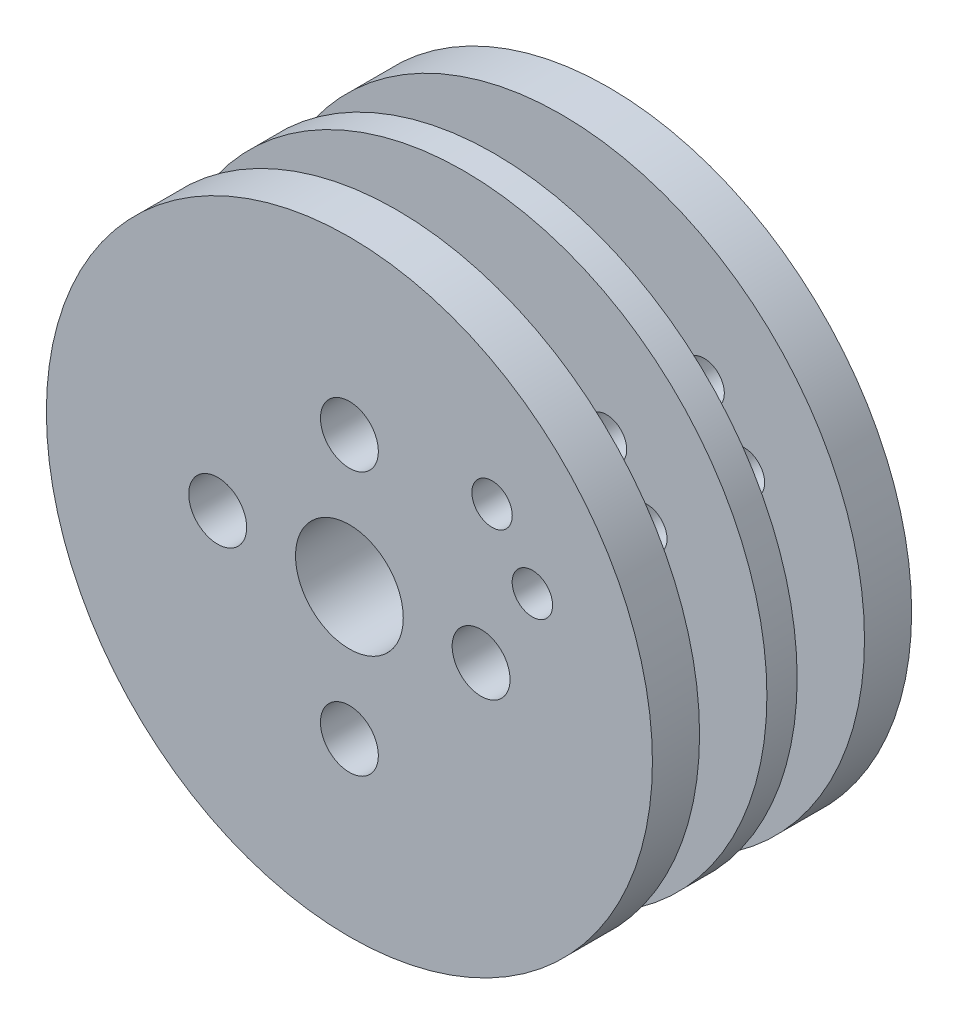
ISO-10303-21;
HEADER;
FILE_DESCRIPTION(('STEP AP214'),'2;1');
FILE_NAME('part.step','',(''),(''),'','','');
FILE_SCHEMA(('AUTOMOTIVE_DESIGN { 1 0 10303 214 1 1 1 1 }'));
ENDSEC;
DATA;
#1=APPLICATION_CONTEXT('core data for automotive mechanical design processes');
#2=APPLICATION_PROTOCOL_DEFINITION('international standard','automotive_design',2000,#1);
#3=PRODUCT_CONTEXT('',#1,'mechanical');
#4=PRODUCT('Part','Part','',(#3));
#5=PRODUCT_RELATED_PRODUCT_CATEGORY('part','',(#4));
#6=PRODUCT_DEFINITION_FORMATION('','',#4);
#7=PRODUCT_DEFINITION_CONTEXT('part definition',#1,'design');
#8=PRODUCT_DEFINITION('design','',#6,#7);
#9=PRODUCT_DEFINITION_SHAPE('','',#8);
#10=(LENGTH_UNIT() NAMED_UNIT(*) SI_UNIT(.MILLI.,.METRE.));
#11=(NAMED_UNIT(*) PLANE_ANGLE_UNIT() SI_UNIT($,.RADIAN.));
#12=(NAMED_UNIT(*) SI_UNIT($,.STERADIAN.) SOLID_ANGLE_UNIT());
#13=UNCERTAINTY_MEASURE_WITH_UNIT(LENGTH_MEASURE(1.E-05),#10,'distance_accuracy_value','');
#14=(GEOMETRIC_REPRESENTATION_CONTEXT(3) GLOBAL_UNCERTAINTY_ASSIGNED_CONTEXT((#13)) GLOBAL_UNIT_ASSIGNED_CONTEXT((#10,
#11,#12)) REPRESENTATION_CONTEXT('',''));
#15=CARTESIAN_POINT('',(0.,0.,0.));
#16=DIRECTION('',(0.,0.,1.));
#17=DIRECTION('',(1.,0.,0.));
#18=AXIS2_PLACEMENT_3D('',#15,#16,#17);
#19=CARTESIAN_POINT('',(0.,0.,2.24600008));
#20=DIRECTION('',(0.,0.,-1.));
#21=DIRECTION('',(-1.,0.,0.));
#22=AXIS2_PLACEMENT_3D('',#19,#20,#21);
#23=CYLINDRICAL_SURFACE('',#22,22.5);
#24=CARTESIAN_POINT('',(0.,0.,2.24600008));
#25=DIRECTION('',(0.,0.,1.));
#26=DIRECTION('',(1.,0.,0.));
#27=AXIS2_PLACEMENT_3D('',#24,#25,#26);
#28=CIRCLE('',#27,22.5);
#29=CARTESIAN_POINT('',(22.5,0.,2.24600008));
#30=VERTEX_POINT('',#29);
#31=EDGE_CURVE('E38',#30,#30,#28,.T.);
#32=ORIENTED_EDGE('',*,*,#31,.F.);
#33=EDGE_LOOP('',(#32));
#34=FACE_BOUND('',#33,.T.);
#35=CARTESIAN_POINT('',(0.,0.,0.));
#36=DIRECTION('',(0.,0.,1.));
#37=DIRECTION('',(1.,0.,0.));
#38=AXIS2_PLACEMENT_3D('',#35,#36,#37);
#39=CIRCLE('',#38,22.5);
#40=CARTESIAN_POINT('',(22.5,0.,0.));
#41=VERTEX_POINT('',#40);
#42=EDGE_CURVE('E43',#41,#41,#39,.T.);
#43=ORIENTED_EDGE('',*,*,#42,.T.);
#44=EDGE_LOOP('',(#43));
#45=FACE_BOUND('',#44,.T.);
#46=ADVANCED_FACE('F31',(#34,#45),#23,.T.);
#47=CARTESIAN_POINT('',(0.,0.,2.24600008));
#48=DIRECTION('',(0.,0.,1.));
#49=DIRECTION('',(1.,0.,0.));
#50=AXIS2_PLACEMENT_3D('',#47,#48,#49);
#51=PLANE('',#50);
#52=CARTESIAN_POINT('',(10.5925065846619,10.6206781447276,2.24600008));
#53=DIRECTION('',(0.,0.,1.));
#54=DIRECTION('',(1.,0.,0.));
#55=AXIS2_PLACEMENT_3D('',#52,#53,#54);
#56=CIRCLE('',#55,1.5);
#57=CARTESIAN_POINT('',(12.0925065846619,10.6206781447276,2.24600008));
#58=VERTEX_POINT('',#57);
#59=EDGE_CURVE('E94',#58,#58,#56,.T.);
#60=ORIENTED_EDGE('',*,*,#59,.F.);
#61=EDGE_LOOP('',(#60));
#62=FACE_BOUND('',#61,.T.);
#63=CARTESIAN_POINT('',(13.5861861345088,6.35732226007865,2.24600008));
#64=DIRECTION('',(0.,0.,1.));
#65=DIRECTION('',(1.,0.,0.));
#66=AXIS2_PLACEMENT_3D('',#63,#64,#65);
#67=CIRCLE('',#66,1.49999999999968);
#68=CARTESIAN_POINT('',(15.0861861345085,6.35732226007865,2.24600008));
#69=VERTEX_POINT('',#68);
#70=EDGE_CURVE('E85',#69,#69,#67,.T.);
#71=ORIENTED_EDGE('',*,*,#70,.F.);
#72=EDGE_LOOP('',(#71));
#73=FACE_BOUND('',#72,.T.);
#74=CARTESIAN_POINT('',(0.,0.,2.24600008));
#75=DIRECTION('',(0.,0.,1.));
#76=DIRECTION('',(1.,0.,0.));
#77=AXIS2_PLACEMENT_3D('',#74,#75,#76);
#78=CIRCLE('',#77,13.);
#79=CARTESIAN_POINT('',(13.,0.,2.24600008));
#80=VERTEX_POINT('',#79);
#81=EDGE_CURVE('E10',#80,#80,#78,.T.);
#82=ORIENTED_EDGE('',*,*,#81,.F.);
#83=EDGE_LOOP('',(#82));
#84=FACE_BOUND('',#83,.T.);
#85=ORIENTED_EDGE('',*,*,#31,.T.);
#86=EDGE_LOOP('',(#85));
#87=FACE_BOUND('',#86,.T.);
#88=ADVANCED_FACE('F125',(#62,#73,#84,#87),#51,.T.);
#89=CARTESIAN_POINT('',(0.,0.,0.));
#90=DIRECTION('',(0.,0.,1.));
#91=DIRECTION('',(1.,0.,0.));
#92=AXIS2_PLACEMENT_3D('',#89,#90,#91);
#93=PLANE('',#92);
#94=CARTESIAN_POINT('',(10.5925065846619,10.6206781447276,0.));
#95=DIRECTION('',(0.,0.,1.));
#96=DIRECTION('',(1.,0.,0.));
#97=AXIS2_PLACEMENT_3D('',#94,#95,#96);
#98=CIRCLE('',#97,1.5);
#99=CARTESIAN_POINT('',(12.0925065846619,10.6206781447276,0.));
#100=VERTEX_POINT('',#99);
#101=EDGE_CURVE('E91',#100,#100,#98,.T.);
#102=ORIENTED_EDGE('',*,*,#101,.T.);
#103=EDGE_LOOP('',(#102));
#104=FACE_BOUND('',#103,.T.);
#105=CARTESIAN_POINT('',(13.5861861345088,6.35732226007865,0.));
#106=DIRECTION('',(0.,0.,1.));
#107=DIRECTION('',(1.,0.,0.));
#108=AXIS2_PLACEMENT_3D('',#105,#106,#107);
#109=CIRCLE('',#108,1.49999999999968);
#110=CARTESIAN_POINT('',(15.0861861345085,6.35732226007865,0.));
#111=VERTEX_POINT('',#110);
#112=EDGE_CURVE('E69',#111,#111,#109,.T.);
#113=ORIENTED_EDGE('',*,*,#112,.T.);
#114=EDGE_LOOP('',(#113));
#115=FACE_BOUND('',#114,.T.);
#116=CARTESIAN_POINT('',(0.,0.,0.));
#117=DIRECTION('',(0.,0.,1.));
#118=DIRECTION('',(1.,0.,0.));
#119=AXIS2_PLACEMENT_3D('',#116,#117,#118);
#120=CIRCLE('',#119,13.);
#121=CARTESIAN_POINT('',(13.,0.,0.));
#122=VERTEX_POINT('',#121);
#123=EDGE_CURVE('E58',#122,#122,#120,.T.);
#124=ORIENTED_EDGE('',*,*,#123,.T.);
#125=EDGE_LOOP('',(#124));
#126=FACE_BOUND('',#125,.T.);
#127=ORIENTED_EDGE('',*,*,#42,.F.);
#128=EDGE_LOOP('',(#127));
#129=FACE_BOUND('',#128,.T.);
#130=ADVANCED_FACE('F130',(#104,#115,#126,#129),#93,.F.);
#131=CARTESIAN_POINT('',(0.,0.,-5.));
#132=DIRECTION('',(0.,0.,1.));
#133=DIRECTION('',(1.,0.,0.));
#134=AXIS2_PLACEMENT_3D('',#131,#132,#133);
#135=CYLINDRICAL_SURFACE('',#134,13.);
#136=CARTESIAN_POINT('',(0.,0.,-5.));
#137=DIRECTION('',(0.,0.,1.));
#138=DIRECTION('',(1.,0.,0.));
#139=AXIS2_PLACEMENT_3D('',#136,#137,#138);
#140=CIRCLE('',#139,13.);
#141=CARTESIAN_POINT('',(13.,0.,-5.));
#142=VERTEX_POINT('',#141);
#143=EDGE_CURVE('E52',#142,#142,#140,.T.);
#144=ORIENTED_EDGE('',*,*,#143,.T.);
#145=EDGE_LOOP('',(#144));
#146=FACE_BOUND('',#145,.T.);
#147=ORIENTED_EDGE('',*,*,#123,.F.);
#148=EDGE_LOOP('',(#147));
#149=FACE_BOUND('',#148,.T.);
#150=ADVANCED_FACE('F138',(#146,#149),#135,.T.);
#151=CARTESIAN_POINT('',(0.,0.,-8.5));
#152=DIRECTION('',(0.,0.,1.));
#153=DIRECTION('',(1.,0.,0.));
#154=AXIS2_PLACEMENT_3D('',#151,#152,#153);
#155=CYLINDRICAL_SURFACE('',#154,22.5);
#156=CARTESIAN_POINT('',(0.,0.,-8.5));
#157=DIRECTION('',(0.,0.,-1.));
#158=DIRECTION('',(-1.,0.,0.));
#159=AXIS2_PLACEMENT_3D('',#156,#157,#158);
#160=CIRCLE('',#159,22.5);
#161=CARTESIAN_POINT('',(22.5,0.,-8.5));
#162=VERTEX_POINT('',#161);
#163=EDGE_CURVE('E49',#162,#162,#160,.T.);
#164=CARTESIAN_POINT('',(0.,0.,-5.));
#165=DIRECTION('',(0.,0.,-1.));
#166=DIRECTION('',(-1.,0.,0.));
#167=AXIS2_PLACEMENT_3D('',#164,#165,#166);
#168=CIRCLE('',#167,22.5);
#169=CARTESIAN_POINT('',(22.5,0.,-5.));
#170=VERTEX_POINT('',#169);
#171=EDGE_CURVE('E53',#170,#170,#168,.T.);
#172=CARTESIAN_POINT('',(22.5,0.,-8.5));
#173=CARTESIAN_POINT('',(22.5,0.,-8.46354166666667));
#174=CARTESIAN_POINT('',(22.5,0.,-8.42708333333333));
#175=CARTESIAN_POINT('',(22.5,0.,-8.35416666666667));
#176=CARTESIAN_POINT('',(22.5,0.,-8.31770833333333));
#177=CARTESIAN_POINT('',(22.5,0.,-8.24479166666667));
#178=CARTESIAN_POINT('',(22.5,0.,-8.20833333333333));
#179=CARTESIAN_POINT('',(22.5,0.,-8.13541666666667));
#180=CARTESIAN_POINT('',(22.5,0.,-8.09895833333333));
#181=CARTESIAN_POINT('',(22.5,0.,-8.02604166666667));
#182=CARTESIAN_POINT('',(22.5,0.,-7.98958333333333));
#183=CARTESIAN_POINT('',(22.5,0.,-7.91666666666667));
#184=CARTESIAN_POINT('',(22.5,0.,-7.88020833333333));
#185=CARTESIAN_POINT('',(22.5,0.,-7.80729166666667));
#186=CARTESIAN_POINT('',(22.5,0.,-7.77083333333333));
#187=CARTESIAN_POINT('',(22.5,0.,-7.69791666666667));
#188=CARTESIAN_POINT('',(22.5,0.,-7.66145833333333));
#189=CARTESIAN_POINT('',(22.5,0.,-7.58854166666667));
#190=CARTESIAN_POINT('',(22.5,0.,-7.55208333333333));
#191=CARTESIAN_POINT('',(22.5,0.,-7.47916666666667));
#192=CARTESIAN_POINT('',(22.5,0.,-7.44270833333333));
#193=CARTESIAN_POINT('',(22.5,0.,-7.36979166666667));
#194=CARTESIAN_POINT('',(22.5,0.,-7.33333333333333));
#195=CARTESIAN_POINT('',(22.5,0.,-7.26041666666667));
#196=CARTESIAN_POINT('',(22.5,0.,-7.22395833333333));
#197=CARTESIAN_POINT('',(22.5,0.,-7.15104166666667));
#198=CARTESIAN_POINT('',(22.5,0.,-7.11458333333333));
#199=CARTESIAN_POINT('',(22.5,0.,-7.04166666666667));
#200=CARTESIAN_POINT('',(22.5,0.,-7.00520833333333));
#201=CARTESIAN_POINT('',(22.5,0.,-6.93229166666667));
#202=CARTESIAN_POINT('',(22.5,0.,-6.89583333333333));
#203=CARTESIAN_POINT('',(22.5,0.,-6.82291666666667));
#204=CARTESIAN_POINT('',(22.5,0.,-6.78645833333333));
#205=CARTESIAN_POINT('',(22.5,0.,-6.71354166666667));
#206=CARTESIAN_POINT('',(22.5,0.,-6.67708333333333));
#207=CARTESIAN_POINT('',(22.5,0.,-6.60416666666667));
#208=CARTESIAN_POINT('',(22.5,0.,-6.56770833333333));
#209=CARTESIAN_POINT('',(22.5,0.,-6.49479166666667));
#210=CARTESIAN_POINT('',(22.5,0.,-6.45833333333333));
#211=CARTESIAN_POINT('',(22.5,0.,-6.38541666666667));
#212=CARTESIAN_POINT('',(22.5,0.,-6.34895833333333));
#213=CARTESIAN_POINT('',(22.5,0.,-6.27604166666667));
#214=CARTESIAN_POINT('',(22.5,0.,-6.23958333333333));
#215=CARTESIAN_POINT('',(22.5,0.,-6.16666666666667));
#216=CARTESIAN_POINT('',(22.5,0.,-6.13020833333333));
#217=CARTESIAN_POINT('',(22.5,0.,-6.05729166666667));
#218=CARTESIAN_POINT('',(22.5,0.,-6.02083333333333));
#219=CARTESIAN_POINT('',(22.5,0.,-5.94791666666667));
#220=CARTESIAN_POINT('',(22.5,0.,-5.91145833333333));
#221=CARTESIAN_POINT('',(22.5,0.,-5.83854166666667));
#222=CARTESIAN_POINT('',(22.5,0.,-5.80208333333333));
#223=CARTESIAN_POINT('',(22.5,0.,-5.72916666666667));
#224=CARTESIAN_POINT('',(22.5,0.,-5.69270833333333));
#225=CARTESIAN_POINT('',(22.5,0.,-5.61979166666667));
#226=CARTESIAN_POINT('',(22.5,0.,-5.58333333333333));
#227=CARTESIAN_POINT('',(22.5,0.,-5.51041666666667));
#228=CARTESIAN_POINT('',(22.5,0.,-5.47395833333333));
#229=CARTESIAN_POINT('',(22.5,0.,-5.40104166666667));
#230=CARTESIAN_POINT('',(22.5,0.,-5.36458333333333));
#231=CARTESIAN_POINT('',(22.5,0.,-5.29166666666667));
#232=CARTESIAN_POINT('',(22.5,0.,-5.25520833333333));
#233=CARTESIAN_POINT('',(22.5,0.,-5.18229166666667));
#234=CARTESIAN_POINT('',(22.5,0.,-5.14583333333333));
#235=CARTESIAN_POINT('',(22.5,0.,-5.07291666666667));
#236=CARTESIAN_POINT('',(22.5,0.,-5.03645833333333));
#237=CARTESIAN_POINT('',(22.5,0.,-5.));
#238=B_SPLINE_CURVE_WITH_KNOTS('',3,(#172,#173,#174,#175,#176,#177,#178,#179,#180,#181,#182,
#183,#184,#185,#186,#187,#188,#189,#190,#191,#192,#193,#194,#195,#196,#197,#198,#199,#200,#201,
#202,#203,#204,#205,#206,#207,#208,#209,#210,#211,#212,#213,#214,#215,#216,#217,#218,#219,#220,
#221,#222,#223,#224,#225,#226,#227,#228,#229,#230,#231,#232,#233,#234,#235,#236,#237),
.UNSPECIFIED.,.F.,.F.,(4,2,2,2,2,2,2,2,2,2,2,2,2,2,2,2,2,2,2,2,2,2,2,2,2,2,2,2,2,2,2,2,4),(0.,
0.109375,0.21875,0.328125,0.4375,0.546875,0.656250000000001,0.765625000000001,0.875000000000001,
0.984375000000001,1.09375,1.203125,1.3125,1.421875,1.53125,1.640625,1.75,1.859375,1.96875,
2.078125,2.1875,2.296875,2.40625,2.515625,2.625,2.734375,2.84375,2.953125,3.0625,3.171875,
3.28125,3.390625,3.5),.UNSPECIFIED.);
#239=EDGE_CURVE('BSEAM143',#162,#170,#238,.T.);
#240=ORIENTED_EDGE('',*,*,#163,.F.);
#241=ORIENTED_EDGE('',*,*,#171,.T.);
#242=ORIENTED_EDGE('',*,*,#239,.T.);
#243=ORIENTED_EDGE('',*,*,#239,.F.);
#244=EDGE_LOOP('',(#240,#242,#241,#243));
#245=FACE_BOUND('',#244,.T.);
#246=ADVANCED_FACE('F143',(#245),#155,.T.);
#247=CARTESIAN_POINT('',(0.,0.,-8.5));
#248=DIRECTION('',(0.,0.,-1.));
#249=DIRECTION('',(-1.,0.,0.));
#250=AXIS2_PLACEMENT_3D('',#247,#248,#249);
#251=PLANE('',#250);
#252=CARTESIAN_POINT('',(-9.77899999999989,-1.14013634719968E-13,-8.5));
#253=DIRECTION('',(0.,0.,1.));
#254=DIRECTION('',(1.,0.,0.));
#255=AXIS2_PLACEMENT_3D('',#252,#253,#254);
#256=CIRCLE('',#255,2.15);
#257=CARTESIAN_POINT('',(-7.62899999999989,-1.14013634719968E-13,-8.5));
#258=VERTEX_POINT('',#257);
#259=EDGE_CURVE('E316',#258,#258,#256,.T.);
#260=ORIENTED_EDGE('',*,*,#259,.T.);
#261=EDGE_LOOP('',(#260));
#262=FACE_BOUND('',#261,.T.);
#263=CARTESIAN_POINT('',(2.25632105230165E-13,-9.779,-8.5));
#264=DIRECTION('',(0.,0.,1.));
#265=DIRECTION('',(1.,0.,0.));
#266=AXIS2_PLACEMENT_3D('',#263,#264,#265);
#267=CIRCLE('',#266,2.15);
#268=CARTESIAN_POINT('',(2.15000000000023,-9.779,-8.5));
#269=VERTEX_POINT('',#268);
#270=EDGE_CURVE('E327',#269,#269,#267,.T.);
#271=ORIENTED_EDGE('',*,*,#270,.T.);
#272=EDGE_LOOP('',(#271));
#273=FACE_BOUND('',#272,.T.);
#274=CARTESIAN_POINT('',(9.77900000000011,1.12816052615082E-13,-8.5));
#275=DIRECTION('',(0.,0.,1.));
#276=DIRECTION('',(1.,0.,0.));
#277=AXIS2_PLACEMENT_3D('',#274,#275,#276);
#278=CIRCLE('',#277,2.15);
#279=CARTESIAN_POINT('',(11.9290000000001,1.12816052615082E-13,-8.5));
#280=VERTEX_POINT('',#279);
#281=EDGE_CURVE('E339',#280,#280,#278,.T.);
#282=ORIENTED_EDGE('',*,*,#281,.T.);
#283=EDGE_LOOP('',(#282));
#284=FACE_BOUND('',#283,.T.);
#285=CARTESIAN_POINT('',(0.,9.779,-8.5));
#286=DIRECTION('',(0.,0.,1.));
#287=DIRECTION('',(1.,0.,0.));
#288=AXIS2_PLACEMENT_3D('',#285,#286,#287);
#289=CIRCLE('',#288,2.15);
#290=CARTESIAN_POINT('',(2.15,9.779,-8.5));
#291=VERTEX_POINT('',#290);
#292=EDGE_CURVE('E77',#291,#291,#289,.T.);
#293=ORIENTED_EDGE('',*,*,#292,.T.);
#294=EDGE_LOOP('',(#293));
#295=FACE_BOUND('',#294,.T.);
#296=CARTESIAN_POINT('',(10.5925065846619,10.6206781447276,-8.5));
#297=DIRECTION('',(0.,0.,1.));
#298=DIRECTION('',(1.,0.,0.));
#299=AXIS2_PLACEMENT_3D('',#296,#297,#298);
#300=CIRCLE('',#299,1.5);
#301=CARTESIAN_POINT('',(12.0925065846619,10.6206781447276,-8.5));
#302=VERTEX_POINT('',#301);
#303=EDGE_CURVE('E301',#302,#302,#300,.T.);
#304=ORIENTED_EDGE('',*,*,#303,.T.);
#305=EDGE_LOOP('',(#304));
#306=FACE_BOUND('',#305,.T.);
#307=CARTESIAN_POINT('',(13.5861861345088,6.35732226007865,-8.5));
#308=DIRECTION('',(0.,0.,1.));
#309=DIRECTION('',(1.,0.,0.));
#310=AXIS2_PLACEMENT_3D('',#307,#308,#309);
#311=CIRCLE('',#310,1.49999999999968);
#312=CARTESIAN_POINT('',(15.0861861345085,6.35732226007865,-8.5));
#313=VERTEX_POINT('',#312);
#314=EDGE_CURVE('E319',#313,#313,#311,.T.);
#315=ORIENTED_EDGE('',*,*,#314,.T.);
#316=EDGE_LOOP('',(#315));
#317=FACE_BOUND('',#316,.T.);
#318=CARTESIAN_POINT('',(0.,0.,-8.5));
#319=DIRECTION('',(0.,0.,1.));
#320=DIRECTION('',(1.,0.,0.));
#321=AXIS2_PLACEMENT_3D('',#318,#319,#320);
#322=CIRCLE('',#321,4.);
#323=CARTESIAN_POINT('',(4.,0.,-8.5));
#324=VERTEX_POINT('',#323);
#325=EDGE_CURVE('E65',#324,#324,#322,.T.);
#326=ORIENTED_EDGE('',*,*,#325,.T.);
#327=EDGE_LOOP('',(#326));
#328=FACE_BOUND('',#327,.T.);
#329=ORIENTED_EDGE('',*,*,#163,.T.);
#330=EDGE_LOOP('',(#329));
#331=FACE_BOUND('',#330,.T.);
#332=ADVANCED_FACE('F150',(#262,#273,#284,#295,#306,#317,#328,#331),#251,.T.);
#333=CARTESIAN_POINT('',(0.,0.,-5.));
#334=DIRECTION('',(0.,0.,-1.));
#335=DIRECTION('',(-1.,0.,0.));
#336=AXIS2_PLACEMENT_3D('',#333,#334,#335);
#337=PLANE('',#336);
#338=CARTESIAN_POINT('',(10.5925065846619,10.6206781447276,-5.));
#339=DIRECTION('',(0.,0.,-1.));
#340=DIRECTION('',(-1.,0.,0.));
#341=AXIS2_PLACEMENT_3D('',#338,#339,#340);
#342=CIRCLE('',#341,1.5);
#343=CARTESIAN_POINT('',(9.09250658466192,10.6206781447276,-5.));
#344=VERTEX_POINT('',#343);
#345=EDGE_CURVE('E88',#344,#344,#342,.T.);
#346=ORIENTED_EDGE('',*,*,#345,.T.);
#347=EDGE_LOOP('',(#346));
#348=FACE_BOUND('',#347,.T.);
#349=CARTESIAN_POINT('',(13.5861861345088,6.35732226007865,-5.));
#350=DIRECTION('',(0.,0.,-1.));
#351=DIRECTION('',(-1.,0.,0.));
#352=AXIS2_PLACEMENT_3D('',#349,#350,#351);
#353=CIRCLE('',#352,1.49999999999968);
#354=CARTESIAN_POINT('',(12.0861861345091,6.35732226007865,-5.));
#355=VERTEX_POINT('',#354);
#356=EDGE_CURVE('E64',#355,#355,#353,.T.);
#357=ORIENTED_EDGE('',*,*,#356,.T.);
#358=EDGE_LOOP('',(#357));
#359=FACE_BOUND('',#358,.T.);
#360=ORIENTED_EDGE('',*,*,#143,.F.);
#361=EDGE_LOOP('',(#360));
#362=FACE_BOUND('',#361,.T.);
#363=ORIENTED_EDGE('',*,*,#171,.F.);
#364=EDGE_LOOP('',(#363));
#365=FACE_BOUND('',#364,.T.);
#366=ADVANCED_FACE('F152',(#348,#359,#362,#365),#337,.F.);
#367=CARTESIAN_POINT('',(0.,0.,7.24600008));
#368=DIRECTION('',(0.,0.,-1.));
#369=DIRECTION('',(-1.,0.,0.));
#370=AXIS2_PLACEMENT_3D('',#367,#368,#369);
#371=CYLINDRICAL_SURFACE('',#370,13.);
#372=CARTESIAN_POINT('',(0.,0.,7.24600008));
#373=DIRECTION('',(0.,0.,1.));
#374=DIRECTION('',(1.,0.,0.));
#375=AXIS2_PLACEMENT_3D('',#372,#373,#374);
#376=CIRCLE('',#375,13.);
#377=CARTESIAN_POINT('',(13.,0.,7.24600008));
#378=VERTEX_POINT('',#377);
#379=EDGE_CURVE('E47',#378,#378,#376,.T.);
#380=ORIENTED_EDGE('',*,*,#379,.F.);
#381=EDGE_LOOP('',(#380));
#382=FACE_BOUND('',#381,.T.);
#383=ORIENTED_EDGE('',*,*,#81,.T.);
#384=EDGE_LOOP('',(#383));
#385=FACE_BOUND('',#384,.T.);
#386=ADVANCED_FACE('F155',(#382,#385),#371,.T.);
#387=CARTESIAN_POINT('',(0.,0.,10.74600008));
#388=DIRECTION('',(0.,0.,-1.));
#389=DIRECTION('',(-1.,0.,0.));
#390=AXIS2_PLACEMENT_3D('',#387,#388,#389);
#391=CYLINDRICAL_SURFACE('',#390,22.5);
#392=CARTESIAN_POINT('',(0.,0.,10.74600008));
#393=DIRECTION('',(0.,0.,1.));
#394=DIRECTION('',(1.,0.,0.));
#395=AXIS2_PLACEMENT_3D('',#392,#393,#394);
#396=CIRCLE('',#395,22.5);
#397=CARTESIAN_POINT('',(-22.5,0.,10.74600008));
#398=VERTEX_POINT('',#397);
#399=EDGE_CURVE('E98',#398,#398,#396,.T.);
#400=CARTESIAN_POINT('',(0.,0.,7.24600008));
#401=DIRECTION('',(0.,0.,1.));
#402=DIRECTION('',(1.,0.,0.));
#403=AXIS2_PLACEMENT_3D('',#400,#401,#402);
#404=CIRCLE('',#403,22.5);
#405=CARTESIAN_POINT('',(-22.5,0.,7.24600008));
#406=VERTEX_POINT('',#405);
#407=EDGE_CURVE('E97',#406,#406,#404,.T.);
#408=CARTESIAN_POINT('',(-22.5,0.,10.74600008));
#409=CARTESIAN_POINT('',(-22.5,0.,10.7095417466667));
#410=CARTESIAN_POINT('',(-22.5,0.,10.6730834133333));
#411=CARTESIAN_POINT('',(-22.5,0.,10.6001667466667));
#412=CARTESIAN_POINT('',(-22.5,0.,10.5637084133333));
#413=CARTESIAN_POINT('',(-22.5,0.,10.4907917466667));
#414=CARTESIAN_POINT('',(-22.5,0.,10.4543334133333));
#415=CARTESIAN_POINT('',(-22.5,0.,10.3814167466667));
#416=CARTESIAN_POINT('',(-22.5,0.,10.3449584133333));
#417=CARTESIAN_POINT('',(-22.5,0.,10.2720417466667));
#418=CARTESIAN_POINT('',(-22.5,0.,10.2355834133333));
#419=CARTESIAN_POINT('',(-22.5,0.,10.1626667466667));
#420=CARTESIAN_POINT('',(-22.5,0.,10.1262084133333));
#421=CARTESIAN_POINT('',(-22.5,0.,10.0532917466667));
#422=CARTESIAN_POINT('',(-22.5,0.,10.0168334133333));
#423=CARTESIAN_POINT('',(-22.5,0.,9.94391674666667));
#424=CARTESIAN_POINT('',(-22.5,0.,9.90745841333333));
#425=CARTESIAN_POINT('',(-22.5,0.,9.83454174666667));
#426=CARTESIAN_POINT('',(-22.5,0.,9.79808341333333));
#427=CARTESIAN_POINT('',(-22.5,0.,9.72516674666667));
#428=CARTESIAN_POINT('',(-22.5,0.,9.68870841333333));
#429=CARTESIAN_POINT('',(-22.5,0.,9.61579174666667));
#430=CARTESIAN_POINT('',(-22.5,0.,9.57933341333333));
#431=CARTESIAN_POINT('',(-22.5,0.,9.50641674666667));
#432=CARTESIAN_POINT('',(-22.5,0.,9.46995841333333));
#433=CARTESIAN_POINT('',(-22.5,0.,9.39704174666667));
#434=CARTESIAN_POINT('',(-22.5,0.,9.36058341333333));
#435=CARTESIAN_POINT('',(-22.5,0.,9.28766674666667));
#436=CARTESIAN_POINT('',(-22.5,0.,9.25120841333333));
#437=CARTESIAN_POINT('',(-22.5,0.,9.17829174666667));
#438=CARTESIAN_POINT('',(-22.5,0.,9.14183341333333));
#439=CARTESIAN_POINT('',(-22.5,0.,9.06891674666667));
#440=CARTESIAN_POINT('',(-22.5,0.,9.03245841333333));
#441=CARTESIAN_POINT('',(-22.5,0.,8.95954174666667));
#442=CARTESIAN_POINT('',(-22.5,0.,8.92308341333333));
#443=CARTESIAN_POINT('',(-22.5,0.,8.85016674666667));
#444=CARTESIAN_POINT('',(-22.5,0.,8.81370841333333));
#445=CARTESIAN_POINT('',(-22.5,0.,8.74079174666667));
#446=CARTESIAN_POINT('',(-22.5,0.,8.70433341333333));
#447=CARTESIAN_POINT('',(-22.5,0.,8.63141674666667));
#448=CARTESIAN_POINT('',(-22.5,0.,8.59495841333333));
#449=CARTESIAN_POINT('',(-22.5,0.,8.52204174666667));
#450=CARTESIAN_POINT('',(-22.5,0.,8.48558341333333));
#451=CARTESIAN_POINT('',(-22.5,0.,8.41266674666667));
#452=CARTESIAN_POINT('',(-22.5,0.,8.37620841333333));
#453=CARTESIAN_POINT('',(-22.5,0.,8.30329174666667));
#454=CARTESIAN_POINT('',(-22.5,0.,8.26683341333333));
#455=CARTESIAN_POINT('',(-22.5,0.,8.19391674666667));
#456=CARTESIAN_POINT('',(-22.5,0.,8.15745841333333));
#457=CARTESIAN_POINT('',(-22.5,0.,8.08454174666667));
#458=CARTESIAN_POINT('',(-22.5,0.,8.04808341333333));
#459=CARTESIAN_POINT('',(-22.5,0.,7.97516674666667));
#460=CARTESIAN_POINT('',(-22.5,0.,7.93870841333333));
#461=CARTESIAN_POINT('',(-22.5,0.,7.86579174666667));
#462=CARTESIAN_POINT('',(-22.5,0.,7.82933341333333));
#463=CARTESIAN_POINT('',(-22.5,0.,7.75641674666667));
#464=CARTESIAN_POINT('',(-22.5,0.,7.71995841333333));
#465=CARTESIAN_POINT('',(-22.5,0.,7.64704174666667));
#466=CARTESIAN_POINT('',(-22.5,0.,7.61058341333333));
#467=CARTESIAN_POINT('',(-22.5,0.,7.53766674666667));
#468=CARTESIAN_POINT('',(-22.5,0.,7.50120841333333));
#469=CARTESIAN_POINT('',(-22.5,0.,7.42829174666667));
#470=CARTESIAN_POINT('',(-22.5,0.,7.39183341333333));
#471=CARTESIAN_POINT('',(-22.5,0.,7.31891674666667));
#472=CARTESIAN_POINT('',(-22.5,0.,7.28245841333333));
#473=CARTESIAN_POINT('',(-22.5,0.,7.24600008));
#474=B_SPLINE_CURVE_WITH_KNOTS('',3,(#408,#409,#410,#411,#412,#413,#414,#415,#416,#417,#418,
#419,#420,#421,#422,#423,#424,#425,#426,#427,#428,#429,#430,#431,#432,#433,#434,#435,#436,#437,
#438,#439,#440,#441,#442,#443,#444,#445,#446,#447,#448,#449,#450,#451,#452,#453,#454,#455,#456,
#457,#458,#459,#460,#461,#462,#463,#464,#465,#466,#467,#468,#469,#470,#471,#472,#473),
.UNSPECIFIED.,.F.,.F.,(4,2,2,2,2,2,2,2,2,2,2,2,2,2,2,2,2,2,2,2,2,2,2,2,2,2,2,2,2,2,2,2,4),(0.,
0.109375,0.21875,0.328125,0.4375,0.546875,0.656250000000001,0.765625000000001,0.875000000000001,
0.984375000000001,1.09375,1.203125,1.3125,1.421875,1.53125,1.640625,1.75,1.859375,1.96875,
2.078125,2.1875,2.296875,2.40625,2.515625,2.625,2.734375,2.84375,2.953125,3.0625,3.171875,
3.28125,3.390625,3.5),.UNSPECIFIED.);
#475=EDGE_CURVE('BSEAM103',#398,#406,#474,.T.);
#476=ORIENTED_EDGE('',*,*,#399,.F.);
#477=ORIENTED_EDGE('',*,*,#407,.T.);
#478=ORIENTED_EDGE('',*,*,#475,.T.);
#479=ORIENTED_EDGE('',*,*,#475,.F.);
#480=EDGE_LOOP('',(#476,#478,#477,#479));
#481=FACE_BOUND('',#480,.T.);
#482=ADVANCED_FACE('F103',(#481),#391,.T.);
#483=CARTESIAN_POINT('',(0.,0.,10.74600008));
#484=DIRECTION('',(0.,0.,1.));
#485=DIRECTION('',(1.,0.,0.));
#486=AXIS2_PLACEMENT_3D('',#483,#484,#485);
#487=PLANE('',#486);
#488=CARTESIAN_POINT('',(-9.77899999999989,-1.14013634719968E-13,10.74600008));
#489=DIRECTION('',(0.,0.,1.));
#490=DIRECTION('',(1.,0.,0.));
#491=AXIS2_PLACEMENT_3D('',#488,#489,#490);
#492=CIRCLE('',#491,2.15);
#493=CARTESIAN_POINT('',(-7.62899999999989,-1.14013634719968E-13,10.74600008));
#494=VERTEX_POINT('',#493);
#495=EDGE_CURVE('E312',#494,#494,#492,.T.);
#496=ORIENTED_EDGE('',*,*,#495,.F.);
#497=EDGE_LOOP('',(#496));
#498=FACE_BOUND('',#497,.T.);
#499=CARTESIAN_POINT('',(2.25632105230165E-13,-9.779,10.74600008));
#500=DIRECTION('',(0.,0.,1.));
#501=DIRECTION('',(1.,0.,0.));
#502=AXIS2_PLACEMENT_3D('',#499,#500,#501);
#503=CIRCLE('',#502,2.15);
#504=CARTESIAN_POINT('',(2.15000000000023,-9.779,10.74600008));
#505=VERTEX_POINT('',#504);
#506=EDGE_CURVE('E330',#505,#505,#503,.T.);
#507=ORIENTED_EDGE('',*,*,#506,.F.);
#508=EDGE_LOOP('',(#507));
#509=FACE_BOUND('',#508,.T.);
#510=CARTESIAN_POINT('',(9.77900000000011,1.12816052615082E-13,10.74600008));
#511=DIRECTION('',(0.,0.,1.));
#512=DIRECTION('',(1.,0.,0.));
#513=AXIS2_PLACEMENT_3D('',#510,#511,#512);
#514=CIRCLE('',#513,2.15);
#515=CARTESIAN_POINT('',(11.9290000000001,1.12816052615082E-13,10.74600008));
#516=VERTEX_POINT('',#515);
#517=EDGE_CURVE('E80',#516,#516,#514,.T.);
#518=ORIENTED_EDGE('',*,*,#517,.F.);
#519=EDGE_LOOP('',(#518));
#520=FACE_BOUND('',#519,.T.);
#521=CARTESIAN_POINT('',(0.,9.779,10.74600008));
#522=DIRECTION('',(0.,0.,1.));
#523=DIRECTION('',(1.,0.,0.));
#524=AXIS2_PLACEMENT_3D('',#521,#522,#523);
#525=CIRCLE('',#524,2.15);
#526=CARTESIAN_POINT('',(2.15,9.779,10.74600008));
#527=VERTEX_POINT('',#526);
#528=EDGE_CURVE('E337',#527,#527,#525,.T.);
#529=ORIENTED_EDGE('',*,*,#528,.F.);
#530=EDGE_LOOP('',(#529));
#531=FACE_BOUND('',#530,.T.);
#532=CARTESIAN_POINT('',(10.5925065846619,10.6206781447276,10.74600008));
#533=DIRECTION('',(0.,0.,1.));
#534=DIRECTION('',(1.,0.,0.));
#535=AXIS2_PLACEMENT_3D('',#532,#533,#534);
#536=CIRCLE('',#535,1.5);
#537=CARTESIAN_POINT('',(12.0925065846619,10.6206781447276,10.74600008));
#538=VERTEX_POINT('',#537);
#539=EDGE_CURVE('E313',#538,#538,#536,.T.);
#540=ORIENTED_EDGE('',*,*,#539,.F.);
#541=EDGE_LOOP('',(#540));
#542=FACE_BOUND('',#541,.T.);
#543=CARTESIAN_POINT('',(13.5861861345088,6.35732226007865,10.74600008));
#544=DIRECTION('',(0.,0.,1.));
#545=DIRECTION('',(1.,0.,0.));
#546=AXIS2_PLACEMENT_3D('',#543,#544,#545);
#547=CIRCLE('',#546,1.49999999999968);
#548=CARTESIAN_POINT('',(15.0861861345085,6.35732226007865,10.74600008));
#549=VERTEX_POINT('',#548);
#550=EDGE_CURVE('E324',#549,#549,#547,.T.);
#551=ORIENTED_EDGE('',*,*,#550,.F.);
#552=EDGE_LOOP('',(#551));
#553=FACE_BOUND('',#552,.T.);
#554=CARTESIAN_POINT('',(0.,0.,10.74600008));
#555=DIRECTION('',(0.,0.,1.));
#556=DIRECTION('',(1.,0.,0.));
#557=AXIS2_PLACEMENT_3D('',#554,#555,#556);
#558=CIRCLE('',#557,4.);
#559=CARTESIAN_POINT('',(4.,0.,10.74600008));
#560=VERTEX_POINT('',#559);
#561=EDGE_CURVE('E72',#560,#560,#558,.T.);
#562=ORIENTED_EDGE('',*,*,#561,.F.);
#563=EDGE_LOOP('',(#562));
#564=FACE_BOUND('',#563,.T.);
#565=ORIENTED_EDGE('',*,*,#399,.T.);
#566=EDGE_LOOP('',(#565));
#567=FACE_BOUND('',#566,.T.);
#568=ADVANCED_FACE('F108',(#498,#509,#520,#531,#542,#553,#564,#567),#487,.T.);
#569=CARTESIAN_POINT('',(0.,0.,7.24600008));
#570=DIRECTION('',(0.,0.,1.));
#571=DIRECTION('',(1.,0.,0.));
#572=AXIS2_PLACEMENT_3D('',#569,#570,#571);
#573=PLANE('',#572);
#574=CARTESIAN_POINT('',(10.5925065846619,10.6206781447276,7.24600008));
#575=DIRECTION('',(0.,0.,1.));
#576=DIRECTION('',(1.,0.,0.));
#577=AXIS2_PLACEMENT_3D('',#574,#575,#576);
#578=CIRCLE('',#577,1.5);
#579=CARTESIAN_POINT('',(12.0925065846619,10.6206781447276,7.24600008));
#580=VERTEX_POINT('',#579);
#581=EDGE_CURVE('E34',#580,#580,#578,.T.);
#582=ORIENTED_EDGE('',*,*,#581,.T.);
#583=EDGE_LOOP('',(#582));
#584=FACE_BOUND('',#583,.T.);
#585=CARTESIAN_POINT('',(13.5861861345088,6.35732226007865,7.24600008));
#586=DIRECTION('',(0.,0.,1.));
#587=DIRECTION('',(1.,0.,0.));
#588=AXIS2_PLACEMENT_3D('',#585,#586,#587);
#589=CIRCLE('',#588,1.49999999999968);
#590=CARTESIAN_POINT('',(15.0861861345085,6.35732226007865,7.24600008));
#591=VERTEX_POINT('',#590);
#592=EDGE_CURVE('E62',#591,#591,#589,.T.);
#593=ORIENTED_EDGE('',*,*,#592,.T.);
#594=EDGE_LOOP('',(#593));
#595=FACE_BOUND('',#594,.T.);
#596=ORIENTED_EDGE('',*,*,#379,.T.);
#597=EDGE_LOOP('',(#596));
#598=FACE_BOUND('',#597,.T.);
#599=ORIENTED_EDGE('',*,*,#407,.F.);
#600=EDGE_LOOP('',(#599));
#601=FACE_BOUND('',#600,.T.);
#602=ADVANCED_FACE('F105',(#584,#595,#598,#601),#573,.F.);
#603=CARTESIAN_POINT('',(13.5861861345088,6.35732226007865,-8.5));
#604=DIRECTION('',(0.,0.,1.));
#605=DIRECTION('',(1.,0.,0.));
#606=AXIS2_PLACEMENT_3D('',#603,#604,#605);
#607=CYLINDRICAL_SURFACE('',#606,1.49999999999968);
#608=ORIENTED_EDGE('',*,*,#550,.T.);
#609=EDGE_LOOP('',(#608));
#610=FACE_BOUND('',#609,.T.);
#611=ORIENTED_EDGE('',*,*,#592,.F.);
#612=EDGE_LOOP('',(#611));
#613=FACE_BOUND('',#612,.T.);
#614=ADVANCED_FACE('F107',(#610,#613),#607,.F.);
#615=CARTESIAN_POINT('',(10.5925065846619,10.6206781447276,-8.5));
#616=DIRECTION('',(0.,0.,1.));
#617=DIRECTION('',(1.,0.,0.));
#618=AXIS2_PLACEMENT_3D('',#615,#616,#617);
#619=CYLINDRICAL_SURFACE('',#618,1.5);
#620=ORIENTED_EDGE('',*,*,#539,.T.);
#621=EDGE_LOOP('',(#620));
#622=FACE_BOUND('',#621,.T.);
#623=ORIENTED_EDGE('',*,*,#581,.F.);
#624=EDGE_LOOP('',(#623));
#625=FACE_BOUND('',#624,.T.);
#626=ADVANCED_FACE('F115',(#622,#625),#619,.F.);
#627=CARTESIAN_POINT('',(0.,0.,-8.5));
#628=DIRECTION('',(0.,0.,1.));
#629=DIRECTION('',(1.,0.,0.));
#630=AXIS2_PLACEMENT_3D('',#627,#628,#629);
#631=CYLINDRICAL_SURFACE('',#630,4.);
#632=ORIENTED_EDGE('',*,*,#325,.F.);
#633=EDGE_LOOP('',(#632));
#634=FACE_BOUND('',#633,.T.);
#635=ORIENTED_EDGE('',*,*,#561,.T.);
#636=EDGE_LOOP('',(#635));
#637=FACE_BOUND('',#636,.T.);
#638=ADVANCED_FACE('F198',(#634,#637),#631,.F.);
#639=CARTESIAN_POINT('',(0.,9.779,-8.5));
#640=DIRECTION('',(0.,0.,1.));
#641=DIRECTION('',(1.,0.,0.));
#642=AXIS2_PLACEMENT_3D('',#639,#640,#641);
#643=CYLINDRICAL_SURFACE('',#642,2.15);
#644=ORIENTED_EDGE('',*,*,#292,.F.);
#645=EDGE_LOOP('',(#644));
#646=FACE_BOUND('',#645,.T.);
#647=ORIENTED_EDGE('',*,*,#528,.T.);
#648=EDGE_LOOP('',(#647));
#649=FACE_BOUND('',#648,.T.);
#650=ADVANCED_FACE('F210',(#646,#649),#643,.F.);
#651=CARTESIAN_POINT('',(9.77900000000011,1.12816052615082E-13,-8.5));
#652=DIRECTION('',(0.,0.,1.));
#653=DIRECTION('',(1.,0.,0.));
#654=AXIS2_PLACEMENT_3D('',#651,#652,#653);
#655=CYLINDRICAL_SURFACE('',#654,2.15);
#656=ORIENTED_EDGE('',*,*,#281,.F.);
#657=EDGE_LOOP('',(#656));
#658=FACE_BOUND('',#657,.T.);
#659=ORIENTED_EDGE('',*,*,#517,.T.);
#660=EDGE_LOOP('',(#659));
#661=FACE_BOUND('',#660,.T.);
#662=ADVANCED_FACE('F220',(#658,#661),#655,.F.);
#663=CARTESIAN_POINT('',(2.25632105230165E-13,-9.779,-8.5));
#664=DIRECTION('',(0.,0.,1.));
#665=DIRECTION('',(1.,0.,0.));
#666=AXIS2_PLACEMENT_3D('',#663,#664,#665);
#667=CYLINDRICAL_SURFACE('',#666,2.15);
#668=ORIENTED_EDGE('',*,*,#270,.F.);
#669=EDGE_LOOP('',(#668));
#670=FACE_BOUND('',#669,.T.);
#671=ORIENTED_EDGE('',*,*,#506,.T.);
#672=EDGE_LOOP('',(#671));
#673=FACE_BOUND('',#672,.T.);
#674=ADVANCED_FACE('F230',(#670,#673),#667,.F.);
#675=CARTESIAN_POINT('',(-9.77899999999989,-1.14013634719968E-13,-8.5));
#676=DIRECTION('',(0.,0.,1.));
#677=DIRECTION('',(1.,0.,0.));
#678=AXIS2_PLACEMENT_3D('',#675,#676,#677);
#679=CYLINDRICAL_SURFACE('',#678,2.15);
#680=ORIENTED_EDGE('',*,*,#259,.F.);
#681=EDGE_LOOP('',(#680));
#682=FACE_BOUND('',#681,.T.);
#683=ORIENTED_EDGE('',*,*,#495,.T.);
#684=EDGE_LOOP('',(#683));
#685=FACE_BOUND('',#684,.T.);
#686=ADVANCED_FACE('F240',(#682,#685),#679,.F.);
#687=ORIENTED_EDGE('',*,*,#314,.F.);
#688=EDGE_LOOP('',(#687));
#689=FACE_BOUND('',#688,.T.);
#690=ORIENTED_EDGE('',*,*,#356,.F.);
#691=EDGE_LOOP('',(#690));
#692=FACE_BOUND('',#691,.T.);
#693=ADVANCED_FACE('F119',(#689,#692),#607,.F.);
#694=ORIENTED_EDGE('',*,*,#303,.F.);
#695=EDGE_LOOP('',(#694));
#696=FACE_BOUND('',#695,.T.);
#697=ORIENTED_EDGE('',*,*,#345,.F.);
#698=EDGE_LOOP('',(#697));
#699=FACE_BOUND('',#698,.T.);
#700=ADVANCED_FACE('F202',(#696,#699),#619,.F.);
#701=ORIENTED_EDGE('',*,*,#70,.T.);
#702=EDGE_LOOP('',(#701));
#703=FACE_BOUND('',#702,.T.);
#704=ORIENTED_EDGE('',*,*,#112,.F.);
#705=EDGE_LOOP('',(#704));
#706=FACE_BOUND('',#705,.T.);
#707=ADVANCED_FACE('F118',(#703,#706),#607,.F.);
#708=ORIENTED_EDGE('',*,*,#59,.T.);
#709=EDGE_LOOP('',(#708));
#710=FACE_BOUND('',#709,.T.);
#711=ORIENTED_EDGE('',*,*,#101,.F.);
#712=EDGE_LOOP('',(#711));
#713=FACE_BOUND('',#712,.T.);
#714=ADVANCED_FACE('F201',(#710,#713),#619,.F.);
#715=CLOSED_SHELL('',(#46,#88,#130,#150,#246,#332,#366,#386,#482,#568,#602,#614,#626,#638,#650,
#662,#674,#686,#693,#700,#707,#714));
#716=MANIFOLD_SOLID_BREP('B2',#715);
#717=ADVANCED_BREP_SHAPE_REPRESENTATION('',(#18,#716),#14);
#718=SHAPE_DEFINITION_REPRESENTATION(#9,#717);
ENDSEC;
END-ISO-10303-21;
